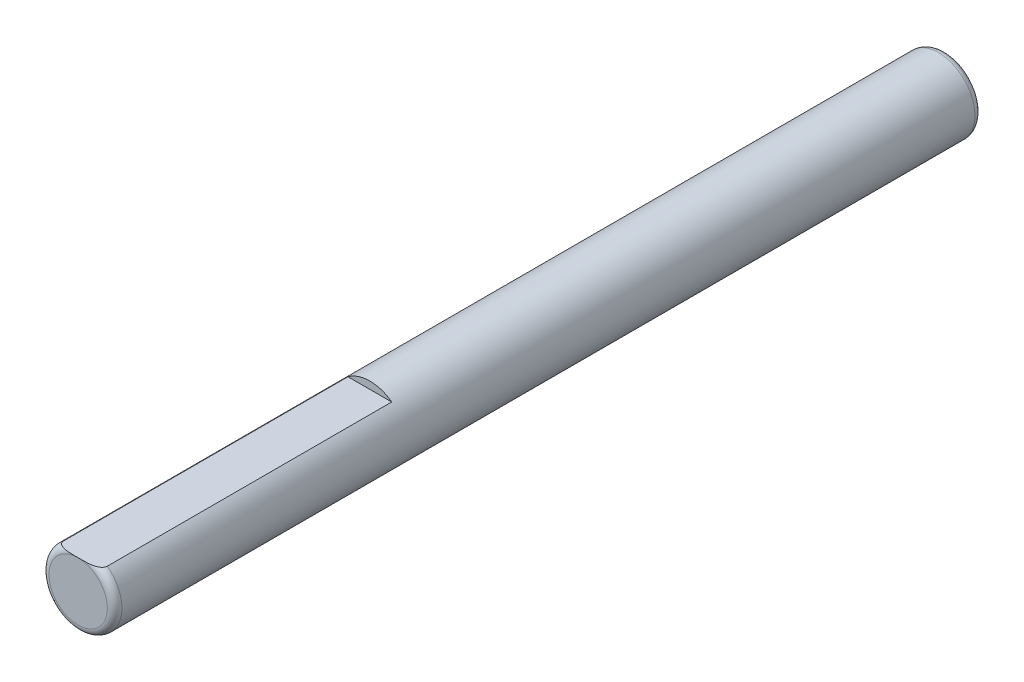
ISO-10303-21;
HEADER;
FILE_DESCRIPTION(('STEP AP214'),'2;1');
FILE_NAME('part.step','',(''),(''),'','','');
FILE_SCHEMA(('AUTOMOTIVE_DESIGN { 1 0 10303 214 1 1 1 1 }'));
ENDSEC;
DATA;
#1=APPLICATION_CONTEXT('core data for automotive mechanical design processes');
#2=APPLICATION_PROTOCOL_DEFINITION('international standard','automotive_design',2000,#1);
#3=PRODUCT_CONTEXT('',#1,'mechanical');
#4=PRODUCT('Part','Part','',(#3));
#5=PRODUCT_RELATED_PRODUCT_CATEGORY('part','',(#4));
#6=PRODUCT_DEFINITION_FORMATION('','',#4);
#7=PRODUCT_DEFINITION_CONTEXT('part definition',#1,'design');
#8=PRODUCT_DEFINITION('design','',#6,#7);
#9=PRODUCT_DEFINITION_SHAPE('','',#8);
#10=(LENGTH_UNIT() NAMED_UNIT(*) SI_UNIT(.MILLI.,.METRE.));
#11=(NAMED_UNIT(*) PLANE_ANGLE_UNIT() SI_UNIT($,.RADIAN.));
#12=(NAMED_UNIT(*) SI_UNIT($,.STERADIAN.) SOLID_ANGLE_UNIT());
#13=UNCERTAINTY_MEASURE_WITH_UNIT(LENGTH_MEASURE(1.E-05),#10,'distance_accuracy_value','');
#14=(GEOMETRIC_REPRESENTATION_CONTEXT(3) GLOBAL_UNCERTAINTY_ASSIGNED_CONTEXT((#13)) GLOBAL_UNIT_ASSIGNED_CONTEXT((#10,
#11,#12)) REPRESENTATION_CONTEXT('',''));
#15=CARTESIAN_POINT('',(0.,0.,0.));
#16=DIRECTION('',(0.,0.,1.));
#17=DIRECTION('',(1.,0.,0.));
#18=AXIS2_PLACEMENT_3D('',#15,#16,#17);
#19=CARTESIAN_POINT('',(0.,0.,29.75));
#20=DIRECTION('',(0.,0.,-1.));
#21=DIRECTION('',(-1.,0.,0.));
#22=AXIS2_PLACEMENT_3D('',#19,#20,#21);
#23=CYLINDRICAL_SURFACE('',#22,2.5);
#24=CARTESIAN_POINT('',(0.,0.,-29.25));
#25=DIRECTION('',(0.,0.,1.));
#26=DIRECTION('',(1.,0.,0.));
#27=AXIS2_PLACEMENT_3D('',#24,#25,#26);
#28=CIRCLE('',#27,2.5);
#29=CARTESIAN_POINT('',(2.5,0.,-29.25));
#30=VERTEX_POINT('',#29);
#31=EDGE_CURVE('E97',#30,#30,#28,.T.);
#32=ORIENTED_EDGE('',*,*,#31,.T.);
#33=EDGE_LOOP('',(#32));
#34=FACE_BOUND('',#33,.T.);
#35=DIRECTION('',(0.,0.,1.));
#36=VECTOR('',#35,1.);
#37=CARTESIAN_POINT('',(1.5,2.,9.75));
#38=LINE('',#37,#36);
#39=CARTESIAN_POINT('',(1.5,2.,9.75));
#40=VERTEX_POINT('',#39);
#41=CARTESIAN_POINT('',(1.5,2.,29.25));
#42=VERTEX_POINT('',#41);
#43=EDGE_CURVE('E72',#40,#42,#38,.T.);
#44=ORIENTED_EDGE('',*,*,#43,.T.);
#45=CARTESIAN_POINT('',(0.,0.,29.25));
#46=DIRECTION('',(0.,0.,1.));
#47=DIRECTION('',(1.,0.,0.));
#48=AXIS2_PLACEMENT_3D('',#45,#46,#47);
#49=CIRCLE('',#48,2.5);
#50=CARTESIAN_POINT('',(-1.5,2.,29.25));
#51=VERTEX_POINT('',#50);
#52=EDGE_CURVE('E93',#42,#51,#49,.F.);
#53=ORIENTED_EDGE('',*,*,#52,.T.);
#54=DIRECTION('',(0.,0.,1.));
#55=VECTOR('',#54,1.);
#56=CARTESIAN_POINT('',(-1.5,2.,9.75));
#57=LINE('',#56,#55);
#58=CARTESIAN_POINT('',(-1.5,2.,9.75));
#59=VERTEX_POINT('',#58);
#60=EDGE_CURVE('E81',#59,#51,#57,.T.);
#61=ORIENTED_EDGE('',*,*,#60,.F.);
#62=CARTESIAN_POINT('',(0.,0.,9.75));
#63=DIRECTION('',(0.,0.,1.));
#64=DIRECTION('',(1.,0.,0.));
#65=AXIS2_PLACEMENT_3D('',#62,#63,#64);
#66=CIRCLE('',#65,2.5);
#67=EDGE_CURVE('E82',#40,#59,#66,.T.);
#68=ORIENTED_EDGE('',*,*,#67,.F.);
#69=EDGE_LOOP('',(#44,#53,#61,#68));
#70=FACE_BOUND('',#69,.T.);
#71=ADVANCED_FACE('F39',(#34,#70),#23,.T.);
#72=CARTESIAN_POINT('',(0.,0.,29.75));
#73=DIRECTION('',(0.,0.,1.));
#74=DIRECTION('',(1.,0.,0.));
#75=AXIS2_PLACEMENT_3D('',#72,#73,#74);
#76=PLANE('',#75);
#77=CARTESIAN_POINT('',(0.,0.,29.75));
#78=DIRECTION('',(0.,0.,1.));
#79=DIRECTION('',(1.,0.,0.));
#80=AXIS2_PLACEMENT_3D('',#77,#78,#79);
#81=CIRCLE('',#80,2.);
#82=CARTESIAN_POINT('',(0.,2.,29.75));
#83=VERTEX_POINT('',#82);
#84=EDGE_CURVE('E105',#83,#83,#81,.T.);
#85=ORIENTED_EDGE('',*,*,#84,.T.);
#86=EDGE_LOOP('',(#85));
#87=FACE_BOUND('',#86,.T.);
#88=ADVANCED_FACE('F118',(#87),#76,.T.);
#89=CARTESIAN_POINT('',(0.,0.,-29.75));
#90=DIRECTION('',(0.,0.,1.));
#91=DIRECTION('',(1.,0.,0.));
#92=AXIS2_PLACEMENT_3D('',#89,#90,#91);
#93=PLANE('',#92);
#94=CARTESIAN_POINT('',(0.,0.,-29.75));
#95=DIRECTION('',(0.,0.,1.));
#96=DIRECTION('',(1.,0.,0.));
#97=AXIS2_PLACEMENT_3D('',#94,#95,#96);
#98=CIRCLE('',#97,2.);
#99=CARTESIAN_POINT('',(2.,0.,-29.75));
#100=VERTEX_POINT('',#99);
#101=EDGE_CURVE('E101',#100,#100,#98,.F.);
#102=ORIENTED_EDGE('',*,*,#101,.T.);
#103=EDGE_LOOP('',(#102));
#104=FACE_BOUND('',#103,.T.);
#105=ADVANCED_FACE('F117',(#104),#93,.F.);
#106=CARTESIAN_POINT('',(0.,2.,9.75));
#107=DIRECTION('',(0.,-1.,0.));
#108=DIRECTION('',(0.,0.,-1.));
#109=AXIS2_PLACEMENT_3D('',#106,#107,#108);
#110=PLANE('',#109);
#111=CARTESIAN_POINT('',(-1.5,2.,29.25));
#112=CARTESIAN_POINT('',(-1.50005508764519,2.,29.2700065150285));
#113=CARTESIAN_POINT('',(-1.49800297503596,2.,29.2899505223803));
#114=CARTESIAN_POINT('',(-1.49017103135305,2.,29.3288908622129));
#115=CARTESIAN_POINT('',(-1.48442943896433,2.,29.347894786355));
#116=CARTESIAN_POINT('',(-1.46971395516312,2.,29.3845007170815));
#117=CARTESIAN_POINT('',(-1.46075157527048,2.,29.4021074472319));
#118=CARTESIAN_POINT('',(-1.44018960181346,2.,29.4357418270518));
#119=CARTESIAN_POINT('',(-1.42858295243753,2.,29.4517650844176));
#120=CARTESIAN_POINT('',(-1.39760924057378,2.,29.4889337995344));
#121=CARTESIAN_POINT('',(-1.37710380043444,2.,29.5091275913188));
#122=CARTESIAN_POINT('',(-1.3332153788633,2.,29.5460193785026));
#123=CARTESIAN_POINT('',(-1.30982929844171,2.,29.5627135559447));
#124=CARTESIAN_POINT('',(-1.24588475655889,2.,29.6025266059827));
#125=CARTESIAN_POINT('',(-1.20375339504332,2.,29.6231102761167));
#126=CARTESIAN_POINT('',(-1.13857481760512,2.,29.6492657628372));
#127=CARTESIAN_POINT('',(-1.11639476146754,2.,29.6572271665565));
#128=CARTESIAN_POINT('',(-1.07158652733005,2.,29.6717347834849));
#129=CARTESIAN_POINT('',(-1.04895868735182,2.,29.6782820228324));
#130=CARTESIAN_POINT('',(-0.982989447767383,2.,29.6954775535542));
#131=CARTESIAN_POINT('',(-0.939240813702876,2.,29.7045494991958));
#132=CARTESIAN_POINT('',(-0.851180575194758,2.,29.7194389319571));
#133=CARTESIAN_POINT('',(-0.806868416119324,2.,29.7252529100803));
#134=CARTESIAN_POINT('',(-0.717748873858504,2.,29.7345404183726));
#135=CARTESIAN_POINT('',(-0.672940110398235,2.,29.7380000262617));
#136=CARTESIAN_POINT('',(-0.583224127430002,2.,29.743276064899));
#137=CARTESIAN_POINT('',(-0.538316886739036,2.,29.7450920982067));
#138=CARTESIAN_POINT('',(-0.452027170138264,2.,29.7475884411658));
#139=CARTESIAN_POINT('',(-0.410646661478026,2.,29.748347176557));
#140=CARTESIAN_POINT('',(-0.327877214900455,2.,29.7493649293624));
#141=CARTESIAN_POINT('',(-0.286488276566585,2.,29.7496239046375));
#142=CARTESIAN_POINT('',(-0.204245986253958,2.,29.7499262759538));
#143=CARTESIAN_POINT('',(-0.163392638975686,2.,29.7499724201265));
#144=CARTESIAN_POINT('',(-0.0816928216893282,2.,29.7499994454164));
#145=CARTESIAN_POINT('',(-0.0408463516913624,2.,29.7499803376138));
#146=CARTESIAN_POINT('',(0.,2.,29.75));
#147=B_SPLINE_CURVE_WITH_KNOTS('',3,(#111,#112,#113,#114,#115,#116,#117,#118,#119,#120,#121,
#122,#123,#124,#125,#126,#127,#128,#129,#130,#131,#132,#133,#134,#135,#136,#137,#138,#139,#140,
#141,#142,#143,#144,#145,#146),.UNSPECIFIED.,.F.,.F.,(4,2,2,2,2,2,2,2,2,2,2,2,2,2,2,2,2,4),(0.,
0.0598154823382548,0.119020807803603,0.178016596524446,0.237171689151975,0.323022405322559,
0.408966299732599,0.548800102010766,0.61947446630953,0.690097374684519,0.823948961414428,
0.957944437366592,1.092725549906,1.2275392458054,1.35169671337948,1.47586464927862,
1.59842472260636,1.72096398530663),.UNSPECIFIED.);
#148=EDGE_CURVE('E54',#51,#83,#147,.T.);
#149=ORIENTED_EDGE('',*,*,#148,.T.);
#150=CARTESIAN_POINT('',(0.,2.,29.75));
#151=CARTESIAN_POINT('',(0.0407626231076289,2.,29.749980484284));
#152=CARTESIAN_POINT('',(0.0815253750922564,2.,29.7499994433899));
#153=CARTESIAN_POINT('',(0.163057529759021,2.,29.7499726519699));
#154=CARTESIAN_POINT('',(0.203826932431489,2.,29.7499268907924));
#155=CARTESIAN_POINT('',(0.285823216792328,2.,29.7496272394696));
#156=CARTESIAN_POINT('',(0.327050094241002,2.,29.7493710177251));
#157=CARTESIAN_POINT('',(0.409495794992682,2.,29.7483653267444));
#158=CARTESIAN_POINT('',(0.450714618676486,2.,29.7476158970779));
#159=CARTESIAN_POINT('',(0.534687159846425,2.,29.7452076449429));
#160=CARTESIAN_POINT('',(0.577440036322863,2.,29.7435155371863));
#161=CARTESIAN_POINT('',(0.662861842446352,2.,29.7386762279352));
#162=CARTESIAN_POINT('',(0.7055307876601,2.,29.7355293281928));
#163=CARTESIAN_POINT('',(0.790467964812873,2.,29.7271629448661));
#164=CARTESIAN_POINT('',(0.832737137282494,2.,29.7219534285849));
#165=CARTESIAN_POINT('',(0.916821134882456,2.,29.7087065375739));
#166=CARTESIAN_POINT('',(0.958636337716516,2.,29.7006717348776));
#167=CARTESIAN_POINT('',(1.01633423815903,2.,29.6868499282799));
#168=CARTESIAN_POINT('',(1.0325980627166,2.,29.6826447414506));
#169=CARTESIAN_POINT('',(1.06494846149724,2.,29.6735803939948));
#170=CARTESIAN_POINT('',(1.08103496638818,2.,29.6687209867408));
#171=CARTESIAN_POINT('',(1.12889043811801,2.,29.6530766101654));
#172=CARTESIAN_POINT('',(1.16032087149606,2.,29.6412104355907));
#173=CARTESIAN_POINT('',(1.22193787642586,2.,29.6138471087185));
#174=CARTESIAN_POINT('',(1.25211017751241,2.,29.5983172442343));
#175=CARTESIAN_POINT('',(1.30987180248264,2.,29.5629711649222));
#176=CARTESIAN_POINT('',(1.33746517402654,2.,29.5431618343013));
#177=CARTESIAN_POINT('',(1.37963467843693,2.,29.5063229296638));
#178=CARTESIAN_POINT('',(1.39542133682361,2.,29.490685118637));
#179=CARTESIAN_POINT('',(1.4245077100884,2.,29.4572261082969));
#180=CARTESIAN_POINT('',(1.43780974319198,2.,29.4394069701865));
#181=CARTESIAN_POINT('',(1.45935751669131,2.,29.4045634610992));
#182=CARTESIAN_POINT('',(1.46806350146973,2.,29.387825568107));
#183=CARTESIAN_POINT('',(1.48256312102217,2.,29.3531430315798));
#184=CARTESIAN_POINT('',(1.48836281472543,2.,29.3352009877708));
#185=CARTESIAN_POINT('',(1.49497096281988,2.,29.3059337018007));
#186=CARTESIAN_POINT('',(1.49684839330713,2.,29.2948421897842));
#187=CARTESIAN_POINT('',(1.49936626406293,2.,29.2725033908703));
#188=CARTESIAN_POINT('',(1.5000048503837,2.,29.2612558958349));
#189=CARTESIAN_POINT('',(1.5,2.,29.25));
#190=B_SPLINE_CURVE_WITH_KNOTS('',3,(#150,#151,#152,#153,#154,#155,#156,#157,#158,#159,#160,
#161,#162,#163,#164,#165,#166,#167,#168,#169,#170,#171,#172,#173,#174,#175,#176,#177,#178,#179,
#180,#181,#182,#183,#184,#185,#186,#187,#188,#189),.UNSPECIFIED.,.F.,.F.,(4,2,2,2,2,2,2,2,2,2,2,
2,2,2,2,2,2,2,2,4),(0.,0.122288098502134,0.244596325308749,0.368278121933788,0.491949996900832,
0.620293921253729,0.748611236515071,0.876315899810973,1.00390460532892,1.05428854590096,
1.10469153363842,1.20529649885782,1.30683621704435,1.4082137927434,1.47468160162245,
1.54108708094665,1.5974625296124,1.65371995469664,1.68740390926937,1.72113823358774),.UNSPECIFIED.);
#191=EDGE_CURVE('E11',#83,#42,#190,.T.);
#192=ORIENTED_EDGE('',*,*,#191,.T.);
#193=ORIENTED_EDGE('',*,*,#43,.F.);
#194=DIRECTION('',(1.,0.,0.));
#195=VECTOR('',#194,1.);
#196=CARTESIAN_POINT('',(0.,2.,9.75));
#197=LINE('',#196,#195);
#198=EDGE_CURVE('E76',#59,#40,#197,.T.);
#199=ORIENTED_EDGE('',*,*,#198,.F.);
#200=ORIENTED_EDGE('',*,*,#60,.T.);
#201=EDGE_LOOP('',(#149,#192,#193,#199,#200));
#202=FACE_BOUND('',#201,.T.);
#203=ADVANCED_FACE('F74',(#202),#110,.F.);
#204=CARTESIAN_POINT('',(0.,0.,9.75));
#205=DIRECTION('',(0.,0.,1.));
#206=DIRECTION('',(1.,0.,0.));
#207=AXIS2_PLACEMENT_3D('',#204,#205,#206);
#208=PLANE('',#207);
#209=ORIENTED_EDGE('',*,*,#198,.T.);
#210=ORIENTED_EDGE('',*,*,#67,.T.);
#211=EDGE_LOOP('',(#209,#210));
#212=FACE_BOUND('',#211,.T.);
#213=ADVANCED_FACE('F85',(#212),#208,.T.);
#214=CARTESIAN_POINT('',(0.,0.,-29.25));
#215=DIRECTION('',(0.,0.,1.));
#216=DIRECTION('',(1.,0.,0.));
#217=AXIS2_PLACEMENT_3D('',#214,#215,#216);
#218=TOROIDAL_SURFACE('',#217,2.,0.5);
#219=ORIENTED_EDGE('',*,*,#101,.F.);
#220=EDGE_LOOP('',(#219));
#221=FACE_BOUND('',#220,.T.);
#222=ORIENTED_EDGE('',*,*,#31,.F.);
#223=EDGE_LOOP('',(#222));
#224=FACE_BOUND('',#223,.T.);
#225=ADVANCED_FACE('F128',(#221,#224),#218,.T.);
#226=CARTESIAN_POINT('',(0.,0.,29.25));
#227=DIRECTION('',(0.,0.,1.));
#228=DIRECTION('',(1.,0.,0.));
#229=AXIS2_PLACEMENT_3D('',#226,#227,#228);
#230=TOROIDAL_SURFACE('',#229,2.,0.5);
#231=ORIENTED_EDGE('',*,*,#148,.F.);
#232=ORIENTED_EDGE('',*,*,#52,.F.);
#233=ORIENTED_EDGE('',*,*,#191,.F.);
#234=ORIENTED_EDGE('',*,*,#84,.F.);
#235=EDGE_LOOP('',(#231,#232,#233,#234));
#236=FACE_BOUND('',#235,.T.);
#237=ADVANCED_FACE('F41',(#236),#230,.T.);
#238=CLOSED_SHELL('',(#71,#88,#105,#203,#213,#225,#237));
#239=MANIFOLD_SOLID_BREP('B2',#238);
#240=ADVANCED_BREP_SHAPE_REPRESENTATION('',(#18,#239),#14);
#241=SHAPE_DEFINITION_REPRESENTATION(#9,#240);
ENDSEC;
END-ISO-10303-21;
